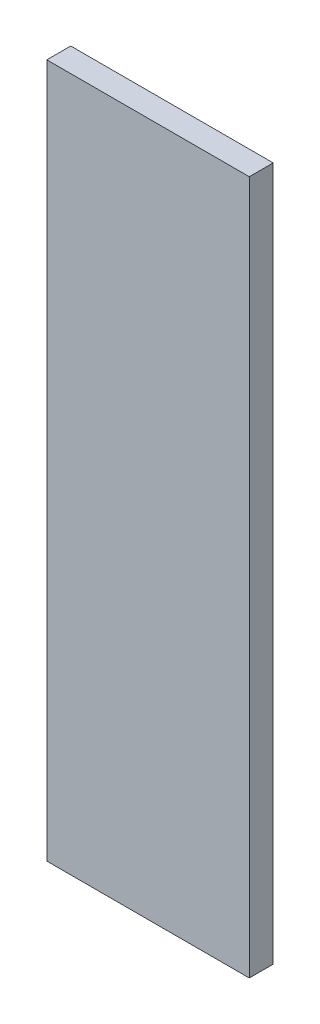
ISO-10303-21;
HEADER;
FILE_DESCRIPTION(('STEP AP214'),'2;1');
FILE_NAME('part.step','',(''),(''),'','','');
FILE_SCHEMA(('AUTOMOTIVE_DESIGN { 1 0 10303 214 1 1 1 1 }'));
ENDSEC;
DATA;
#1=APPLICATION_CONTEXT('core data for automotive mechanical design processes');
#2=APPLICATION_PROTOCOL_DEFINITION('international standard','automotive_design',2000,#1);
#3=PRODUCT_CONTEXT('',#1,'mechanical');
#4=PRODUCT('Part','Part','',(#3));
#5=PRODUCT_RELATED_PRODUCT_CATEGORY('part','',(#4));
#6=PRODUCT_DEFINITION_FORMATION('','',#4);
#7=PRODUCT_DEFINITION_CONTEXT('part definition',#1,'design');
#8=PRODUCT_DEFINITION('design','',#6,#7);
#9=PRODUCT_DEFINITION_SHAPE('','',#8);
#10=(LENGTH_UNIT() NAMED_UNIT(*) SI_UNIT(.MILLI.,.METRE.));
#11=(NAMED_UNIT(*) PLANE_ANGLE_UNIT() SI_UNIT($,.RADIAN.));
#12=(NAMED_UNIT(*) SI_UNIT($,.STERADIAN.) SOLID_ANGLE_UNIT());
#13=UNCERTAINTY_MEASURE_WITH_UNIT(LENGTH_MEASURE(1.E-05),#10,'distance_accuracy_value','');
#14=(GEOMETRIC_REPRESENTATION_CONTEXT(3) GLOBAL_UNCERTAINTY_ASSIGNED_CONTEXT((#13)) GLOBAL_UNIT_ASSIGNED_CONTEXT((#10,
#11,#12)) REPRESENTATION_CONTEXT('',''));
#15=CARTESIAN_POINT('',(0.,0.,0.));
#16=DIRECTION('',(0.,0.,1.));
#17=DIRECTION('',(1.,0.,0.));
#18=AXIS2_PLACEMENT_3D('',#15,#16,#17);
#19=CARTESIAN_POINT('',(-7.30769230769229,15.,0.5));
#20=DIRECTION('',(0.,-1.,0.));
#21=DIRECTION('',(0.,0.,-1.));
#22=AXIS2_PLACEMENT_3D('',#19,#20,#21);
#23=PLANE('',#22);
#24=DIRECTION('',(-1.,0.,0.));
#25=VECTOR('',#24,1.);
#26=CARTESIAN_POINT('',(-7.30769230769229,15.,0.));
#27=LINE('',#26,#25);
#28=CARTESIAN_POINT('',(-7.30769230769229,15.,0.));
#29=VERTEX_POINT('',#28);
#30=CARTESIAN_POINT('',(-11.5384615384615,15.,0.));
#31=VERTEX_POINT('',#30);
#32=EDGE_CURVE('E84',#29,#31,#27,.T.);
#33=ORIENTED_EDGE('',*,*,#32,.T.);
#34=DIRECTION('',(0.,0.,-1.));
#35=VECTOR('',#34,1.);
#36=CARTESIAN_POINT('',(-11.5384615384615,15.,0.5));
#37=LINE('',#36,#35);
#38=CARTESIAN_POINT('',(-11.5384615384615,15.,0.5));
#39=VERTEX_POINT('',#38);
#40=EDGE_CURVE('E90',#39,#31,#37,.T.);
#41=ORIENTED_EDGE('',*,*,#40,.F.);
#42=DIRECTION('',(-1.,0.,0.));
#43=VECTOR('',#42,1.);
#44=CARTESIAN_POINT('',(-7.30769230769229,15.,0.5));
#45=LINE('',#44,#43);
#46=CARTESIAN_POINT('',(-7.30769230769229,15.,0.5));
#47=VERTEX_POINT('',#46);
#48=EDGE_CURVE('E104',#47,#39,#45,.T.);
#49=ORIENTED_EDGE('',*,*,#48,.F.);
#50=DIRECTION('',(0.,0.,-1.));
#51=VECTOR('',#50,1.);
#52=CARTESIAN_POINT('',(-7.30769230769229,15.,0.5));
#53=LINE('',#52,#51);
#54=EDGE_CURVE('E48',#47,#29,#53,.T.);
#55=ORIENTED_EDGE('',*,*,#54,.T.);
#56=EDGE_LOOP('',(#33,#41,#49,#55));
#57=FACE_BOUND('',#56,.T.);
#58=ADVANCED_FACE('F39',(#57),#23,.F.);
#59=CARTESIAN_POINT('',(0.,0.,0.5));
#60=DIRECTION('',(0.,0.,1.));
#61=DIRECTION('',(1.,0.,0.));
#62=AXIS2_PLACEMENT_3D('',#59,#60,#61);
#63=PLANE('',#62);
#64=DIRECTION('',(-1.,0.,0.));
#65=VECTOR('',#64,1.);
#66=CARTESIAN_POINT('',(0.,0.5,0.5));
#67=LINE('',#66,#65);
#68=CARTESIAN_POINT('',(-7.30769230769229,0.5,0.5));
#69=VERTEX_POINT('',#68);
#70=CARTESIAN_POINT('',(-11.5384615384615,0.5,0.5));
#71=VERTEX_POINT('',#70);
#72=EDGE_CURVE('E72',#69,#71,#67,.T.);
#73=ORIENTED_EDGE('',*,*,#72,.F.);
#74=DIRECTION('',(0.,1.,0.));
#75=VECTOR('',#74,1.);
#76=CARTESIAN_POINT('',(-7.30769230769229,-7.38581730769231,0.5));
#77=LINE('',#76,#75);
#78=EDGE_CURVE('E77',#69,#47,#77,.T.);
#79=ORIENTED_EDGE('',*,*,#78,.T.);
#80=ORIENTED_EDGE('',*,*,#48,.T.);
#81=DIRECTION('',(0.,-1.,0.));
#82=VECTOR('',#81,1.);
#83=CARTESIAN_POINT('',(-11.5384615384615,15.,0.5));
#84=LINE('',#83,#82);
#85=EDGE_CURVE('E98',#39,#71,#84,.T.);
#86=ORIENTED_EDGE('',*,*,#85,.T.);
#87=EDGE_LOOP('',(#73,#79,#80,#86));
#88=FACE_BOUND('',#87,.T.);
#89=ADVANCED_FACE('F112',(#88),#63,.T.);
#90=CARTESIAN_POINT('',(-11.5384615384615,15.,0.5));
#91=DIRECTION('',(1.,0.,0.));
#92=DIRECTION('',(0.,0.,-1.));
#93=AXIS2_PLACEMENT_3D('',#90,#91,#92);
#94=PLANE('',#93);
#95=DIRECTION('',(0.,-1.,0.));
#96=VECTOR('',#95,1.);
#97=CARTESIAN_POINT('',(-11.5384615384615,15.,0.));
#98=LINE('',#97,#96);
#99=CARTESIAN_POINT('',(-11.5384615384615,0.5,0.));
#100=VERTEX_POINT('',#99);
#101=EDGE_CURVE('E95',#31,#100,#98,.T.);
#102=ORIENTED_EDGE('',*,*,#101,.T.);
#103=DIRECTION('',(0.,0.,1.));
#104=VECTOR('',#103,1.);
#105=CARTESIAN_POINT('',(-11.5384615384615,0.5,0.5));
#106=LINE('',#105,#104);
#107=EDGE_CURVE('E67',#100,#71,#106,.T.);
#108=ORIENTED_EDGE('',*,*,#107,.T.);
#109=ORIENTED_EDGE('',*,*,#85,.F.);
#110=ORIENTED_EDGE('',*,*,#40,.T.);
#111=EDGE_LOOP('',(#102,#108,#109,#110));
#112=FACE_BOUND('',#111,.T.);
#113=ADVANCED_FACE('F100',(#112),#94,.F.);
#114=CARTESIAN_POINT('',(-7.30769230769229,-7.38581730769231,0.5));
#115=DIRECTION('',(-1.,0.,0.));
#116=DIRECTION('',(0.,0.,1.));
#117=AXIS2_PLACEMENT_3D('',#114,#115,#116);
#118=PLANE('',#117);
#119=ORIENTED_EDGE('',*,*,#78,.F.);
#120=DIRECTION('',(0.,0.,-1.));
#121=VECTOR('',#120,1.);
#122=CARTESIAN_POINT('',(-7.30769230769229,0.5,0.5));
#123=LINE('',#122,#121);
#124=CARTESIAN_POINT('',(-7.30769230769229,0.5,0.));
#125=VERTEX_POINT('',#124);
#126=EDGE_CURVE('E54',#69,#125,#123,.T.);
#127=ORIENTED_EDGE('',*,*,#126,.T.);
#128=DIRECTION('',(0.,1.,0.));
#129=VECTOR('',#128,1.);
#130=CARTESIAN_POINT('',(-7.30769230769229,-7.38581730769231,0.));
#131=LINE('',#130,#129);
#132=EDGE_CURVE('E93',#125,#29,#131,.T.);
#133=ORIENTED_EDGE('',*,*,#132,.T.);
#134=ORIENTED_EDGE('',*,*,#54,.F.);
#135=EDGE_LOOP('',(#119,#127,#133,#134));
#136=FACE_BOUND('',#135,.T.);
#137=ADVANCED_FACE('F41',(#136),#118,.F.);
#138=CARTESIAN_POINT('',(0.,0.,0.));
#139=DIRECTION('',(0.,0.,1.));
#140=DIRECTION('',(1.,0.,0.));
#141=AXIS2_PLACEMENT_3D('',#138,#139,#140);
#142=PLANE('',#141);
#143=DIRECTION('',(1.,0.,0.));
#144=VECTOR('',#143,1.);
#145=CARTESIAN_POINT('',(-17.,0.5,0.));
#146=LINE('',#145,#144);
#147=EDGE_CURVE('E11',#100,#125,#146,.T.);
#148=ORIENTED_EDGE('',*,*,#147,.F.);
#149=ORIENTED_EDGE('',*,*,#101,.F.);
#150=ORIENTED_EDGE('',*,*,#32,.F.);
#151=ORIENTED_EDGE('',*,*,#132,.F.);
#152=EDGE_LOOP('',(#148,#149,#150,#151));
#153=FACE_BOUND('',#152,.T.);
#154=ADVANCED_FACE('F102',(#153),#142,.F.);
#155=CARTESIAN_POINT('',(-17.,0.5,1.));
#156=DIRECTION('',(0.,1.,0.));
#157=DIRECTION('',(0.,0.,1.));
#158=AXIS2_PLACEMENT_3D('',#155,#156,#157);
#159=PLANE('',#158);
#160=ORIENTED_EDGE('',*,*,#72,.T.);
#161=ORIENTED_EDGE('',*,*,#107,.F.);
#162=ORIENTED_EDGE('',*,*,#147,.T.);
#163=ORIENTED_EDGE('',*,*,#126,.F.);
#164=EDGE_LOOP('',(#160,#161,#162,#163));
#165=FACE_BOUND('',#164,.T.);
#166=ADVANCED_FACE('F118',(#165),#159,.F.);
#167=CLOSED_SHELL('',(#58,#89,#113,#137,#154,#166));
#168=MANIFOLD_SOLID_BREP('B2',#167);
#169=ADVANCED_BREP_SHAPE_REPRESENTATION('',(#18,#168),#14);
#170=SHAPE_DEFINITION_REPRESENTATION(#9,#169);
ENDSEC;
END-ISO-10303-21;
